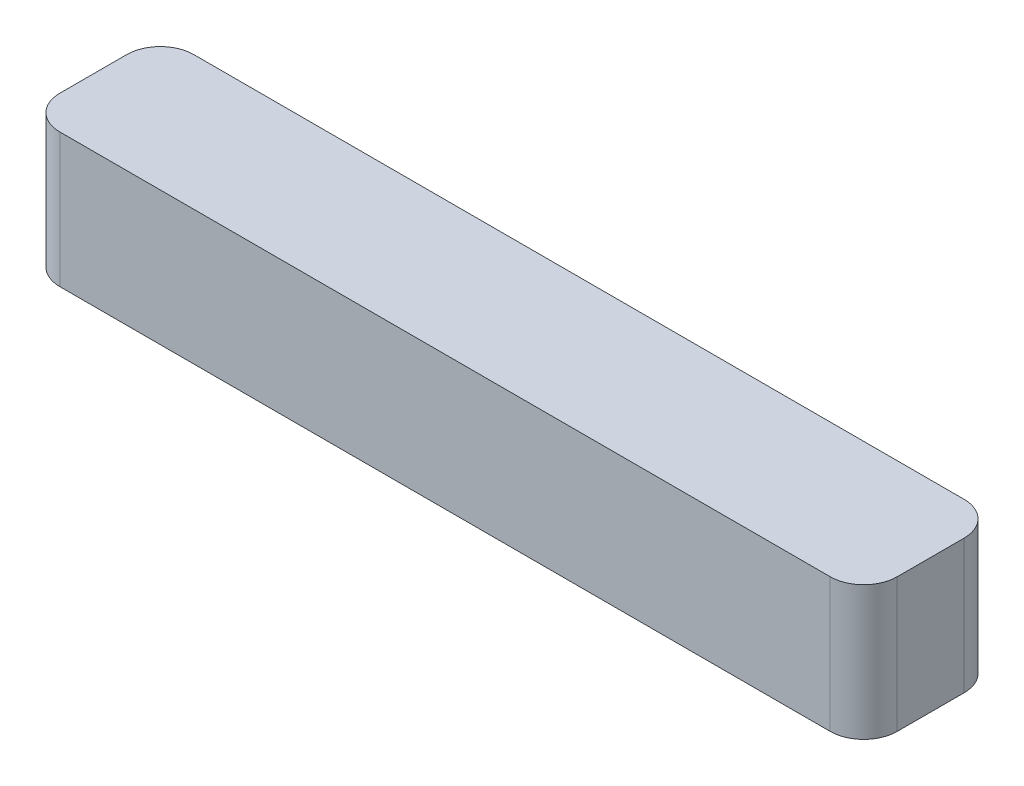
ISO-10303-21;
HEADER;
FILE_DESCRIPTION(('STEP AP214'),'2;1');
FILE_NAME('part.step','',(''),(''),'','','');
FILE_SCHEMA(('AUTOMOTIVE_DESIGN { 1 0 10303 214 1 1 1 1 }'));
ENDSEC;
DATA;
#1=APPLICATION_CONTEXT('core data for automotive mechanical design processes');
#2=APPLICATION_PROTOCOL_DEFINITION('international standard','automotive_design',2000,#1);
#3=PRODUCT_CONTEXT('',#1,'mechanical');
#4=PRODUCT('Part','Part','',(#3));
#5=PRODUCT_RELATED_PRODUCT_CATEGORY('part','',(#4));
#6=PRODUCT_DEFINITION_FORMATION('','',#4);
#7=PRODUCT_DEFINITION_CONTEXT('part definition',#1,'design');
#8=PRODUCT_DEFINITION('design','',#6,#7);
#9=PRODUCT_DEFINITION_SHAPE('','',#8);
#10=(LENGTH_UNIT() NAMED_UNIT(*) SI_UNIT(.MILLI.,.METRE.));
#11=(NAMED_UNIT(*) PLANE_ANGLE_UNIT() SI_UNIT($,.RADIAN.));
#12=(NAMED_UNIT(*) SI_UNIT($,.STERADIAN.) SOLID_ANGLE_UNIT());
#13=UNCERTAINTY_MEASURE_WITH_UNIT(LENGTH_MEASURE(1.E-05),#10,'distance_accuracy_value','');
#14=(GEOMETRIC_REPRESENTATION_CONTEXT(3) GLOBAL_UNCERTAINTY_ASSIGNED_CONTEXT((#13)) GLOBAL_UNIT_ASSIGNED_CONTEXT((#10,
#11,#12)) REPRESENTATION_CONTEXT('',''));
#15=CARTESIAN_POINT('',(0.,0.,0.));
#16=DIRECTION('',(0.,0.,1.));
#17=DIRECTION('',(1.,0.,0.));
#18=AXIS2_PLACEMENT_3D('',#15,#16,#17);
#19=CARTESIAN_POINT('',(11.5,4.,-1.));
#20=DIRECTION('',(0.,-1.,0.));
#21=DIRECTION('',(0.,0.,-1.));
#22=AXIS2_PLACEMENT_3D('',#19,#20,#21);
#23=CYLINDRICAL_SURFACE('',#22,1.);
#24=CARTESIAN_POINT('',(11.5,0.,-1.));
#25=DIRECTION('',(0.,1.,0.));
#26=DIRECTION('',(0.,0.,-1.));
#27=AXIS2_PLACEMENT_3D('',#24,#25,#26);
#28=CIRCLE('',#27,1.);
#29=CARTESIAN_POINT('',(12.5,0.,-1.));
#30=VERTEX_POINT('',#29);
#31=CARTESIAN_POINT('',(11.5,0.,-2.));
#32=VERTEX_POINT('',#31);
#33=EDGE_CURVE('E131',#30,#32,#28,.T.);
#34=ORIENTED_EDGE('',*,*,#33,.T.);
#35=DIRECTION('',(0.,-1.,0.));
#36=VECTOR('',#35,1.);
#37=CARTESIAN_POINT('',(11.5,4.,-2.));
#38=LINE('',#37,#36);
#39=CARTESIAN_POINT('',(11.5,4.,-2.));
#40=VERTEX_POINT('',#39);
#41=EDGE_CURVE('E11',#40,#32,#38,.T.);
#42=ORIENTED_EDGE('',*,*,#41,.F.);
#43=CARTESIAN_POINT('',(11.5,4.,-1.));
#44=DIRECTION('',(0.,1.,0.));
#45=DIRECTION('',(0.,0.,-1.));
#46=AXIS2_PLACEMENT_3D('',#43,#44,#45);
#47=CIRCLE('',#46,1.);
#48=CARTESIAN_POINT('',(12.5,4.,-1.));
#49=VERTEX_POINT('',#48);
#50=EDGE_CURVE('E145',#49,#40,#47,.T.);
#51=ORIENTED_EDGE('',*,*,#50,.F.);
#52=DIRECTION('',(0.,-1.,0.));
#53=VECTOR('',#52,1.);
#54=CARTESIAN_POINT('',(12.5,4.,-1.));
#55=LINE('',#54,#53);
#56=EDGE_CURVE('E127',#49,#30,#55,.T.);
#57=ORIENTED_EDGE('',*,*,#56,.T.);
#58=EDGE_LOOP('',(#34,#42,#51,#57));
#59=FACE_BOUND('',#58,.T.);
#60=ADVANCED_FACE('F35',(#59),#23,.T.);
#61=CARTESIAN_POINT('',(-11.5,4.,-2.));
#62=DIRECTION('',(0.,0.,1.));
#63=DIRECTION('',(1.,0.,0.));
#64=AXIS2_PLACEMENT_3D('',#61,#62,#63);
#65=PLANE('',#64);
#66=DIRECTION('',(-1.,0.,0.));
#67=VECTOR('',#66,1.);
#68=CARTESIAN_POINT('',(-11.5,0.,-2.));
#69=LINE('',#68,#67);
#70=CARTESIAN_POINT('',(-11.5,0.,-2.));
#71=VERTEX_POINT('',#70);
#72=EDGE_CURVE('E134',#32,#71,#69,.T.);
#73=ORIENTED_EDGE('',*,*,#72,.T.);
#74=DIRECTION('',(0.,-1.,0.));
#75=VECTOR('',#74,1.);
#76=CARTESIAN_POINT('',(-11.5,4.,-2.));
#77=LINE('',#76,#75);
#78=CARTESIAN_POINT('',(-11.5,4.,-2.));
#79=VERTEX_POINT('',#78);
#80=EDGE_CURVE('E43',#79,#71,#77,.T.);
#81=ORIENTED_EDGE('',*,*,#80,.F.);
#82=DIRECTION('',(-1.,0.,0.));
#83=VECTOR('',#82,1.);
#84=CARTESIAN_POINT('',(-11.5,4.,-2.));
#85=LINE('',#84,#83);
#86=EDGE_CURVE('E94',#40,#79,#85,.T.);
#87=ORIENTED_EDGE('',*,*,#86,.F.);
#88=ORIENTED_EDGE('',*,*,#41,.T.);
#89=EDGE_LOOP('',(#73,#81,#87,#88));
#90=FACE_BOUND('',#89,.T.);
#91=ADVANCED_FACE('F180',(#90),#65,.F.);
#92=CARTESIAN_POINT('',(-11.5,4.,-1.));
#93=DIRECTION('',(0.,-1.,0.));
#94=DIRECTION('',(0.,0.,-1.));
#95=AXIS2_PLACEMENT_3D('',#92,#93,#94);
#96=CYLINDRICAL_SURFACE('',#95,1.);
#97=CARTESIAN_POINT('',(-11.5,0.,-1.));
#98=DIRECTION('',(0.,1.,0.));
#99=DIRECTION('',(0.,0.,1.));
#100=AXIS2_PLACEMENT_3D('',#97,#98,#99);
#101=CIRCLE('',#100,1.);
#102=CARTESIAN_POINT('',(-12.5,0.,-1.));
#103=VERTEX_POINT('',#102);
#104=EDGE_CURVE('E136',#71,#103,#101,.T.);
#105=ORIENTED_EDGE('',*,*,#104,.T.);
#106=DIRECTION('',(0.,-1.,0.));
#107=VECTOR('',#106,1.);
#108=CARTESIAN_POINT('',(-12.5,4.,-1.));
#109=LINE('',#108,#107);
#110=CARTESIAN_POINT('',(-12.5,4.,-1.));
#111=VERTEX_POINT('',#110);
#112=EDGE_CURVE('E152',#111,#103,#109,.T.);
#113=ORIENTED_EDGE('',*,*,#112,.F.);
#114=CARTESIAN_POINT('',(-11.5,4.,-1.));
#115=DIRECTION('',(0.,1.,0.));
#116=DIRECTION('',(0.,0.,1.));
#117=AXIS2_PLACEMENT_3D('',#114,#115,#116);
#118=CIRCLE('',#117,1.);
#119=EDGE_CURVE('E160',#79,#111,#118,.T.);
#120=ORIENTED_EDGE('',*,*,#119,.F.);
#121=ORIENTED_EDGE('',*,*,#80,.T.);
#122=EDGE_LOOP('',(#105,#113,#120,#121));
#123=FACE_BOUND('',#122,.T.);
#124=ADVANCED_FACE('F158',(#123),#96,.T.);
#125=CARTESIAN_POINT('',(-12.5,4.,-1.));
#126=DIRECTION('',(1.,0.,0.));
#127=DIRECTION('',(0.,0.,-1.));
#128=AXIS2_PLACEMENT_3D('',#125,#126,#127);
#129=PLANE('',#128);
#130=DIRECTION('',(0.,0.,1.));
#131=VECTOR('',#130,1.);
#132=CARTESIAN_POINT('',(-12.5,0.,-1.));
#133=LINE('',#132,#131);
#134=CARTESIAN_POINT('',(-12.5,0.,1.));
#135=VERTEX_POINT('',#134);
#136=EDGE_CURVE('E138',#103,#135,#133,.T.);
#137=ORIENTED_EDGE('',*,*,#136,.T.);
#138=DIRECTION('',(0.,-1.,0.));
#139=VECTOR('',#138,1.);
#140=CARTESIAN_POINT('',(-12.5,4.,1.));
#141=LINE('',#140,#139);
#142=CARTESIAN_POINT('',(-12.5,4.,1.));
#143=VERTEX_POINT('',#142);
#144=EDGE_CURVE('E149',#143,#135,#141,.T.);
#145=ORIENTED_EDGE('',*,*,#144,.F.);
#146=DIRECTION('',(0.,0.,1.));
#147=VECTOR('',#146,1.);
#148=CARTESIAN_POINT('',(-12.5,4.,-1.));
#149=LINE('',#148,#147);
#150=EDGE_CURVE('E172',#111,#143,#149,.T.);
#151=ORIENTED_EDGE('',*,*,#150,.F.);
#152=ORIENTED_EDGE('',*,*,#112,.T.);
#153=EDGE_LOOP('',(#137,#145,#151,#152));
#154=FACE_BOUND('',#153,.T.);
#155=ADVANCED_FACE('F168',(#154),#129,.F.);
#156=CARTESIAN_POINT('',(-11.5,4.,1.));
#157=DIRECTION('',(0.,-1.,0.));
#158=DIRECTION('',(0.,0.,-1.));
#159=AXIS2_PLACEMENT_3D('',#156,#157,#158);
#160=CYLINDRICAL_SURFACE('',#159,1.);
#161=CARTESIAN_POINT('',(-11.5,0.,1.));
#162=DIRECTION('',(0.,1.,0.));
#163=DIRECTION('',(0.,0.,1.));
#164=AXIS2_PLACEMENT_3D('',#161,#162,#163);
#165=CIRCLE('',#164,1.);
#166=CARTESIAN_POINT('',(-11.5,0.,2.));
#167=VERTEX_POINT('',#166);
#168=EDGE_CURVE('E140',#135,#167,#165,.T.);
#169=ORIENTED_EDGE('',*,*,#168,.T.);
#170=DIRECTION('',(0.,-1.,0.));
#171=VECTOR('',#170,1.);
#172=CARTESIAN_POINT('',(-11.5,4.,2.));
#173=LINE('',#172,#171);
#174=CARTESIAN_POINT('',(-11.5,4.,2.));
#175=VERTEX_POINT('',#174);
#176=EDGE_CURVE('E122',#175,#167,#173,.T.);
#177=ORIENTED_EDGE('',*,*,#176,.F.);
#178=CARTESIAN_POINT('',(-11.5,4.,1.));
#179=DIRECTION('',(0.,1.,0.));
#180=DIRECTION('',(0.,0.,1.));
#181=AXIS2_PLACEMENT_3D('',#178,#179,#180);
#182=CIRCLE('',#181,1.);
#183=EDGE_CURVE('E113',#143,#175,#182,.T.);
#184=ORIENTED_EDGE('',*,*,#183,.F.);
#185=ORIENTED_EDGE('',*,*,#144,.T.);
#186=EDGE_LOOP('',(#169,#177,#184,#185));
#187=FACE_BOUND('',#186,.T.);
#188=ADVANCED_FACE('F171',(#187),#160,.T.);
#189=CARTESIAN_POINT('',(-11.5,4.,2.));
#190=DIRECTION('',(0.,0.,-1.));
#191=DIRECTION('',(-1.,0.,0.));
#192=AXIS2_PLACEMENT_3D('',#189,#190,#191);
#193=PLANE('',#192);
#194=DIRECTION('',(1.,0.,0.));
#195=VECTOR('',#194,1.);
#196=CARTESIAN_POINT('',(-11.5,0.,2.));
#197=LINE('',#196,#195);
#198=CARTESIAN_POINT('',(11.5,0.,2.));
#199=VERTEX_POINT('',#198);
#200=EDGE_CURVE('E121',#167,#199,#197,.T.);
#201=ORIENTED_EDGE('',*,*,#200,.T.);
#202=DIRECTION('',(0.,-1.,0.));
#203=VECTOR('',#202,1.);
#204=CARTESIAN_POINT('',(11.5,4.,2.));
#205=LINE('',#204,#203);
#206=CARTESIAN_POINT('',(11.5,4.,2.));
#207=VERTEX_POINT('',#206);
#208=EDGE_CURVE('E118',#207,#199,#205,.T.);
#209=ORIENTED_EDGE('',*,*,#208,.F.);
#210=DIRECTION('',(1.,0.,0.));
#211=VECTOR('',#210,1.);
#212=CARTESIAN_POINT('',(-11.5,4.,2.));
#213=LINE('',#212,#211);
#214=EDGE_CURVE('E107',#175,#207,#213,.T.);
#215=ORIENTED_EDGE('',*,*,#214,.F.);
#216=ORIENTED_EDGE('',*,*,#176,.T.);
#217=EDGE_LOOP('',(#201,#209,#215,#216));
#218=FACE_BOUND('',#217,.T.);
#219=ADVANCED_FACE('F119',(#218),#193,.F.);
#220=CARTESIAN_POINT('',(11.5,4.,1.));
#221=DIRECTION('',(0.,-1.,0.));
#222=DIRECTION('',(0.,0.,-1.));
#223=AXIS2_PLACEMENT_3D('',#220,#221,#222);
#224=CYLINDRICAL_SURFACE('',#223,1.);
#225=CARTESIAN_POINT('',(11.5,0.,1.));
#226=DIRECTION('',(0.,1.,0.));
#227=DIRECTION('',(0.,0.,1.));
#228=AXIS2_PLACEMENT_3D('',#225,#226,#227);
#229=CIRCLE('',#228,1.);
#230=CARTESIAN_POINT('',(12.5,0.,1.));
#231=VERTEX_POINT('',#230);
#232=EDGE_CURVE('E80',#199,#231,#229,.T.);
#233=ORIENTED_EDGE('',*,*,#232,.T.);
#234=DIRECTION('',(0.,-1.,0.));
#235=VECTOR('',#234,1.);
#236=CARTESIAN_POINT('',(12.5,4.,1.));
#237=LINE('',#236,#235);
#238=CARTESIAN_POINT('',(12.5,4.,1.));
#239=VERTEX_POINT('',#238);
#240=EDGE_CURVE('E123',#239,#231,#237,.T.);
#241=ORIENTED_EDGE('',*,*,#240,.F.);
#242=CARTESIAN_POINT('',(11.5,4.,1.));
#243=DIRECTION('',(0.,1.,0.));
#244=DIRECTION('',(0.,0.,1.));
#245=AXIS2_PLACEMENT_3D('',#242,#243,#244);
#246=CIRCLE('',#245,1.);
#247=EDGE_CURVE('E111',#207,#239,#246,.T.);
#248=ORIENTED_EDGE('',*,*,#247,.F.);
#249=ORIENTED_EDGE('',*,*,#208,.T.);
#250=EDGE_LOOP('',(#233,#241,#248,#249));
#251=FACE_BOUND('',#250,.T.);
#252=ADVANCED_FACE('F125',(#251),#224,.T.);
#253=CARTESIAN_POINT('',(12.5,4.,-1.));
#254=DIRECTION('',(-1.,0.,0.));
#255=DIRECTION('',(0.,0.,1.));
#256=AXIS2_PLACEMENT_3D('',#253,#254,#255);
#257=PLANE('',#256);
#258=DIRECTION('',(0.,0.,-1.));
#259=VECTOR('',#258,1.);
#260=CARTESIAN_POINT('',(12.5,0.,-1.));
#261=LINE('',#260,#259);
#262=EDGE_CURVE('E86',#231,#30,#261,.T.);
#263=ORIENTED_EDGE('',*,*,#262,.T.);
#264=ORIENTED_EDGE('',*,*,#56,.F.);
#265=DIRECTION('',(0.,0.,-1.));
#266=VECTOR('',#265,1.);
#267=CARTESIAN_POINT('',(12.5,4.,-1.));
#268=LINE('',#267,#266);
#269=EDGE_CURVE('E51',#239,#49,#268,.T.);
#270=ORIENTED_EDGE('',*,*,#269,.F.);
#271=ORIENTED_EDGE('',*,*,#240,.T.);
#272=EDGE_LOOP('',(#263,#264,#270,#271));
#273=FACE_BOUND('',#272,.T.);
#274=ADVANCED_FACE('F196',(#273),#257,.F.);
#275=CARTESIAN_POINT('',(11.5,4.,-1.));
#276=DIRECTION('',(0.,-1.,0.));
#277=DIRECTION('',(0.,0.,-1.));
#278=AXIS2_PLACEMENT_3D('',#275,#276,#277);
#279=PLANE('',#278);
#280=ORIENTED_EDGE('',*,*,#50,.T.);
#281=ORIENTED_EDGE('',*,*,#86,.T.);
#282=ORIENTED_EDGE('',*,*,#119,.T.);
#283=ORIENTED_EDGE('',*,*,#150,.T.);
#284=ORIENTED_EDGE('',*,*,#183,.T.);
#285=ORIENTED_EDGE('',*,*,#214,.T.);
#286=ORIENTED_EDGE('',*,*,#247,.T.);
#287=ORIENTED_EDGE('',*,*,#269,.T.);
#288=EDGE_LOOP('',(#280,#281,#282,#283,#284,#285,#286,#287));
#289=FACE_BOUND('',#288,.T.);
#290=ADVANCED_FACE('F109',(#289),#279,.F.);
#291=CARTESIAN_POINT('',(11.5,0.,-1.));
#292=DIRECTION('',(0.,-1.,0.));
#293=DIRECTION('',(0.,0.,-1.));
#294=AXIS2_PLACEMENT_3D('',#291,#292,#293);
#295=PLANE('',#294);
#296=ORIENTED_EDGE('',*,*,#33,.F.);
#297=ORIENTED_EDGE('',*,*,#262,.F.);
#298=ORIENTED_EDGE('',*,*,#232,.F.);
#299=ORIENTED_EDGE('',*,*,#200,.F.);
#300=ORIENTED_EDGE('',*,*,#168,.F.);
#301=ORIENTED_EDGE('',*,*,#136,.F.);
#302=ORIENTED_EDGE('',*,*,#104,.F.);
#303=ORIENTED_EDGE('',*,*,#72,.F.);
#304=EDGE_LOOP('',(#296,#297,#298,#299,#300,#301,#302,#303));
#305=FACE_BOUND('',#304,.T.);
#306=ADVANCED_FACE('F164',(#305),#295,.T.);
#307=CLOSED_SHELL('',(#60,#91,#124,#155,#188,#219,#252,#274,#290,#306));
#308=MANIFOLD_SOLID_BREP('B2',#307);
#309=ADVANCED_BREP_SHAPE_REPRESENTATION('',(#18,#308),#14);
#310=SHAPE_DEFINITION_REPRESENTATION(#9,#309);
ENDSEC;
END-ISO-10303-21;
